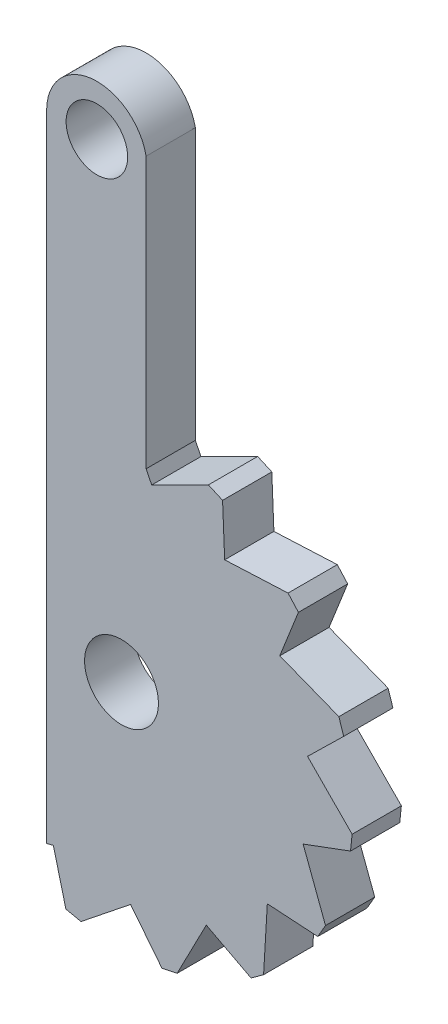
ISO-10303-21;
HEADER;
FILE_DESCRIPTION(('STEP AP214'),'2;1');
FILE_NAME('part.step','',(''),(''),'','','');
FILE_SCHEMA(('AUTOMOTIVE_DESIGN { 1 0 10303 214 1 1 1 1 }'));
ENDSEC;
DATA;
#1=APPLICATION_CONTEXT('core data for automotive mechanical design processes');
#2=APPLICATION_PROTOCOL_DEFINITION('international standard','automotive_design',2000,#1);
#3=PRODUCT_CONTEXT('',#1,'mechanical');
#4=PRODUCT('Part','Part','',(#3));
#5=PRODUCT_RELATED_PRODUCT_CATEGORY('part','',(#4));
#6=PRODUCT_DEFINITION_FORMATION('','',#4);
#7=PRODUCT_DEFINITION_CONTEXT('part definition',#1,'design');
#8=PRODUCT_DEFINITION('design','',#6,#7);
#9=PRODUCT_DEFINITION_SHAPE('','',#8);
#10=(LENGTH_UNIT() NAMED_UNIT(*) SI_UNIT(.MILLI.,.METRE.));
#11=(NAMED_UNIT(*) PLANE_ANGLE_UNIT() SI_UNIT($,.RADIAN.));
#12=(NAMED_UNIT(*) SI_UNIT($,.STERADIAN.) SOLID_ANGLE_UNIT());
#13=UNCERTAINTY_MEASURE_WITH_UNIT(LENGTH_MEASURE(1.E-05),#10,'distance_accuracy_value','');
#14=(GEOMETRIC_REPRESENTATION_CONTEXT(3) GLOBAL_UNCERTAINTY_ASSIGNED_CONTEXT((#13)) GLOBAL_UNIT_ASSIGNED_CONTEXT((#10,
#11,#12)) REPRESENTATION_CONTEXT('',''));
#15=CARTESIAN_POINT('',(0.,0.,0.));
#16=DIRECTION('',(0.,0.,1.));
#17=DIRECTION('',(1.,0.,0.));
#18=AXIS2_PLACEMENT_3D('',#15,#16,#17);
#19=CARTESIAN_POINT('',(-1.00000000000001,18.5923454833598,2.));
#20=DIRECTION('',(0.,0.,-1.));
#21=DIRECTION('',(-1.,0.,0.));
#22=AXIS2_PLACEMENT_3D('',#19,#20,#21);
#23=CYLINDRICAL_SURFACE('',#22,2.04112278046599);
#24=CARTESIAN_POINT('',(-1.00000000000001,18.5923454833598,0.));
#25=DIRECTION('',(0.,0.,1.));
#26=DIRECTION('',(1.,0.,0.));
#27=AXIS2_PLACEMENT_3D('',#24,#25,#26);
#28=CIRCLE('',#27,2.04112278046599);
#29=CARTESIAN_POINT('',(0.999999999999993,19.0000000000001,0.));
#30=VERTEX_POINT('',#29);
#31=CARTESIAN_POINT('',(-3.04095863782557,18.6182306841976,0.));
#32=VERTEX_POINT('',#31);
#33=EDGE_CURVE('E267',#30,#32,#28,.T.);
#34=ORIENTED_EDGE('',*,*,#33,.T.);
#35=DIRECTION('',(0.,0.,-1.));
#36=VECTOR('',#35,1.);
#37=CARTESIAN_POINT('',(-3.04095863782557,18.6182306841976,2.));
#38=LINE('',#37,#36);
#39=CARTESIAN_POINT('',(-3.04095863782557,18.6182306841976,2.));
#40=VERTEX_POINT('',#39);
#41=EDGE_CURVE('E11',#40,#32,#38,.T.);
#42=ORIENTED_EDGE('',*,*,#41,.F.);
#43=CARTESIAN_POINT('',(-1.00000000000001,18.5923454833598,2.));
#44=DIRECTION('',(0.,0.,1.));
#45=DIRECTION('',(1.,0.,0.));
#46=AXIS2_PLACEMENT_3D('',#43,#44,#45);
#47=CIRCLE('',#46,2.04112278046599);
#48=CARTESIAN_POINT('',(0.999999999999993,19.0000000000001,2.));
#49=VERTEX_POINT('',#48);
#50=EDGE_CURVE('E356',#49,#40,#47,.T.);
#51=ORIENTED_EDGE('',*,*,#50,.F.);
#52=DIRECTION('',(0.,0.,-1.));
#53=VECTOR('',#52,1.);
#54=CARTESIAN_POINT('',(0.999999999999993,19.0000000000001,2.));
#55=LINE('',#54,#53);
#56=EDGE_CURVE('E52',#49,#30,#55,.T.);
#57=ORIENTED_EDGE('',*,*,#56,.T.);
#58=EDGE_LOOP('',(#34,#42,#51,#57));
#59=FACE_BOUND('',#58,.T.);
#60=ADVANCED_FACE('F36',(#59),#23,.T.);
#61=CARTESIAN_POINT('',(-3.04095863782854,4.85407544590212E-13,2.));
#62=DIRECTION('',(1.,-1.59623198603196E-13,0.));
#63=DIRECTION('',(1.59623198603196E-13,1.,0.));
#64=AXIS2_PLACEMENT_3D('',#61,#62,#63);
#65=PLANE('',#64);
#66=DIRECTION('',(-1.59623198603196E-13,-1.,0.));
#67=VECTOR('',#66,1.);
#68=CARTESIAN_POINT('',(-3.04095863782854,4.85407544590212E-13,0.));
#69=LINE('',#68,#67);
#70=CARTESIAN_POINT('',(-3.04095863782969,-7.19778887463136,0.));
#71=VERTEX_POINT('',#70);
#72=EDGE_CURVE('E269',#32,#71,#69,.T.);
#73=ORIENTED_EDGE('',*,*,#72,.T.);
#74=DIRECTION('',(0.,0.,-1.));
#75=VECTOR('',#74,1.);
#76=CARTESIAN_POINT('',(-3.04095863782969,-7.19778887463136,2.));
#77=LINE('',#76,#75);
#78=CARTESIAN_POINT('',(-3.04095863782969,-7.19778887463136,2.));
#79=VERTEX_POINT('',#78);
#80=EDGE_CURVE('E44',#79,#71,#77,.T.);
#81=ORIENTED_EDGE('',*,*,#80,.F.);
#82=DIRECTION('',(-1.59623198603196E-13,-1.,0.));
#83=VECTOR('',#82,1.);
#84=CARTESIAN_POINT('',(-3.04095863782854,4.85407544590212E-13,2.));
#85=LINE('',#84,#83);
#86=EDGE_CURVE('E154',#40,#79,#85,.T.);
#87=ORIENTED_EDGE('',*,*,#86,.F.);
#88=ORIENTED_EDGE('',*,*,#41,.T.);
#89=EDGE_LOOP('',(#73,#81,#87,#88));
#90=FACE_BOUND('',#89,.T.);
#91=ADVANCED_FACE('F411',(#90),#65,.F.);
#92=CARTESIAN_POINT('',(1.56534970078855,-5.99504923017567,2.));
#93=DIRECTION('',(0.25263704337826,-0.967561121745335,0.));
#94=DIRECTION('',(0.967561121745335,0.25263704337826,0.));
#95=AXIS2_PLACEMENT_3D('',#92,#93,#94);
#96=PLANE('',#95);
#97=DIRECTION('',(-0.967561121745335,-0.25263704337826,0.));
#98=VECTOR('',#97,1.);
#99=CARTESIAN_POINT('',(1.56534970078855,-5.99504923017567,0.));
#100=LINE('',#99,#98);
#101=CARTESIAN_POINT('',(-2.76871844959144,-7.12670503847929,0.));
#102=VERTEX_POINT('',#101);
#103=EDGE_CURVE('E272',#102,#71,#100,.T.);
#104=ORIENTED_EDGE('',*,*,#103,.F.);
#105=DIRECTION('',(0.,0.,-1.));
#106=VECTOR('',#105,1.);
#107=CARTESIAN_POINT('',(-2.76871844959144,-7.12670503847929,2.));
#108=LINE('',#107,#106);
#109=CARTESIAN_POINT('',(-2.76871844959144,-7.12670503847929,2.));
#110=VERTEX_POINT('',#109);
#111=EDGE_CURVE('E404',#110,#102,#108,.T.);
#112=ORIENTED_EDGE('',*,*,#111,.F.);
#113=DIRECTION('',(-0.967561121745335,-0.25263704337826,0.));
#114=VECTOR('',#113,1.);
#115=CARTESIAN_POINT('',(1.56534970078855,-5.99504923017567,2.));
#116=LINE('',#115,#114);
#117=EDGE_CURVE('E410',#110,#79,#116,.T.);
#118=ORIENTED_EDGE('',*,*,#117,.T.);
#119=ORIENTED_EDGE('',*,*,#80,.T.);
#120=EDGE_LOOP('',(#104,#112,#118,#119));
#121=FACE_BOUND('',#120,.T.);
#122=ADVANCED_FACE('F408',(#121),#96,.T.);
#123=CARTESIAN_POINT('',(-4.31252105353549,-1.10575207483053,2.));
#124=DIRECTION('',(0.968665084890065,0.248370596719746,0.));
#125=DIRECTION('',(-0.248370596719746,0.968665084890065,0.));
#126=AXIS2_PLACEMENT_3D('',#123,#124,#125);
#127=PLANE('',#126);
#128=DIRECTION('',(0.248370596719746,-0.968665084890065,0.));
#129=VECTOR('',#128,1.);
#130=CARTESIAN_POINT('',(-4.31252105353549,-1.10575207483053,0.));
#131=LINE('',#130,#129);
#132=CARTESIAN_POINT('',(-2.25894839994869,-9.11484878388727,0.));
#133=VERTEX_POINT('',#132);
#134=EDGE_CURVE('E275',#102,#133,#131,.T.);
#135=ORIENTED_EDGE('',*,*,#134,.T.);
#136=DIRECTION('',(0.,0.,-1.));
#137=VECTOR('',#136,1.);
#138=CARTESIAN_POINT('',(-2.25894839994869,-9.11484878388727,2.));
#139=LINE('',#138,#137);
#140=CARTESIAN_POINT('',(-2.25894839994869,-9.11484878388727,2.));
#141=VERTEX_POINT('',#140);
#142=EDGE_CURVE('E402',#141,#133,#139,.T.);
#143=ORIENTED_EDGE('',*,*,#142,.F.);
#144=DIRECTION('',(0.248370596719746,-0.968665084890065,0.));
#145=VECTOR('',#144,1.);
#146=CARTESIAN_POINT('',(-4.31252105353549,-1.10575207483053,2.));
#147=LINE('',#146,#145);
#148=EDGE_CURVE('E423',#110,#141,#147,.T.);
#149=ORIENTED_EDGE('',*,*,#148,.F.);
#150=ORIENTED_EDGE('',*,*,#111,.T.);
#151=EDGE_LOOP('',(#135,#143,#149,#150));
#152=FACE_BOUND('',#151,.T.);
#153=ADVANCED_FACE('F420',(#152),#127,.F.);
#154=CARTESIAN_POINT('',(-1.95131967331422,-9.18023728829162,2.));
#155=DIRECTION('',(-0.207911690817762,-0.978147600733805,0.));
#156=DIRECTION('',(0.978147600733805,-0.207911690817762,0.));
#157=AXIS2_PLACEMENT_3D('',#154,#155,#156);
#158=PLANE('',#157);
#159=DIRECTION('',(-0.978147600733805,0.207911690817762,0.));
#160=VECTOR('',#159,1.);
#161=CARTESIAN_POINT('',(-1.95131967331422,-9.18023728829162,0.));
#162=LINE('',#161,#160);
#163=CARTESIAN_POINT('',(-1.64369094667786,-9.24562579269637,0.));
#164=VERTEX_POINT('',#163);
#165=EDGE_CURVE('E278',#164,#133,#162,.T.);
#166=ORIENTED_EDGE('',*,*,#165,.F.);
#167=DIRECTION('',(0.,0.,-1.));
#168=VECTOR('',#167,1.);
#169=CARTESIAN_POINT('',(-1.64369094667786,-9.24562579269637,2.));
#170=LINE('',#169,#168);
#171=CARTESIAN_POINT('',(-1.64369094667786,-9.24562579269637,2.));
#172=VERTEX_POINT('',#171);
#173=EDGE_CURVE('E400',#172,#164,#170,.T.);
#174=ORIENTED_EDGE('',*,*,#173,.F.);
#175=DIRECTION('',(-0.978147600733805,0.207911690817762,0.));
#176=VECTOR('',#175,1.);
#177=CARTESIAN_POINT('',(-1.95131967331422,-9.18023728829162,2.));
#178=LINE('',#177,#176);
#179=EDGE_CURVE('E425',#172,#141,#178,.T.);
#180=ORIENTED_EDGE('',*,*,#179,.T.);
#181=ORIENTED_EDGE('',*,*,#142,.T.);
#182=EDGE_LOOP('',(#166,#174,#180,#181));
#183=FACE_BOUND('',#182,.T.);
#184=ADVANCED_FACE('F517',(#183),#158,.T.);
#185=CARTESIAN_POINT('',(3.86842430773349,-4.840064910032,2.));
#186=DIRECTION('',(0.624337986039853,-0.781154324821735,0.));
#187=DIRECTION('',(0.781154324821735,0.624337986039853,0.));
#188=AXIS2_PLACEMENT_3D('',#185,#186,#187);
#189=PLANE('',#188);
#190=DIRECTION('',(-0.781154324821735,-0.624337986039853,0.));
#191=VECTOR('',#190,1.);
#192=CARTESIAN_POINT('',(3.86842430773349,-4.840064910032,0.));
#193=LINE('',#192,#191);
#194=CARTESIAN_POINT('',(0.369341920426934,-7.63670826367027,0.));
#195=VERTEX_POINT('',#194);
#196=EDGE_CURVE('E281',#195,#164,#193,.T.);
#197=ORIENTED_EDGE('',*,*,#196,.F.);
#198=DIRECTION('',(0.,0.,-1.));
#199=VECTOR('',#198,1.);
#200=CARTESIAN_POINT('',(0.369341920426934,-7.63670826367027,2.));
#201=LINE('',#200,#199);
#202=CARTESIAN_POINT('',(0.369341920426934,-7.63670826367027,2.));
#203=VERTEX_POINT('',#202);
#204=EDGE_CURVE('E398',#203,#195,#201,.T.);
#205=ORIENTED_EDGE('',*,*,#204,.F.);
#206=DIRECTION('',(-0.781154324821735,-0.624337986039853,0.));
#207=VECTOR('',#206,1.);
#208=CARTESIAN_POINT('',(3.86842430773349,-4.840064910032,2.));
#209=LINE('',#208,#207);
#210=EDGE_CURVE('E432',#203,#172,#209,.T.);
#211=ORIENTED_EDGE('',*,*,#210,.T.);
#212=ORIENTED_EDGE('',*,*,#173,.T.);
#213=EDGE_LOOP('',(#197,#205,#211,#212));
#214=FACE_BOUND('',#213,.T.);
#215=ADVANCED_FACE('F520',(#214),#189,.T.);
#216=CARTESIAN_POINT('',(-3.4899341324546,-2.76421512174847,2.));
#217=DIRECTION('',(0.78389816552983,0.620889415338164,0.));
#218=DIRECTION('',(-0.620889415338164,0.78389816552983,0.));
#219=AXIS2_PLACEMENT_3D('',#216,#217,#218);
#220=PLANE('',#219);
#221=DIRECTION('',(0.620889415338164,-0.78389816552983,0.));
#222=VECTOR('',#221,1.);
#223=CARTESIAN_POINT('',(-3.4899341324546,-2.76421512174847,0.));
#224=LINE('',#223,#222);
#225=CARTESIAN_POINT('',(1.64369094667964,-9.24562579269618,0.));
#226=VERTEX_POINT('',#225);
#227=EDGE_CURVE('E284',#195,#226,#224,.T.);
#228=ORIENTED_EDGE('',*,*,#227,.T.);
#229=DIRECTION('',(0.,0.,-1.));
#230=VECTOR('',#229,1.);
#231=CARTESIAN_POINT('',(1.64369094667964,-9.24562579269618,2.));
#232=LINE('',#231,#230);
#233=CARTESIAN_POINT('',(1.64369094667964,-9.24562579269618,2.));
#234=VERTEX_POINT('',#233);
#235=EDGE_CURVE('E396',#234,#226,#232,.T.);
#236=ORIENTED_EDGE('',*,*,#235,.F.);
#237=DIRECTION('',(0.620889415338164,-0.78389816552983,0.));
#238=VECTOR('',#237,1.);
#239=CARTESIAN_POINT('',(-3.4899341324546,-2.76421512174847,2.));
#240=LINE('',#239,#238);
#241=EDGE_CURVE('E435',#203,#234,#240,.T.);
#242=ORIENTED_EDGE('',*,*,#241,.F.);
#243=ORIENTED_EDGE('',*,*,#204,.T.);
#244=EDGE_LOOP('',(#228,#236,#242,#243));
#245=FACE_BOUND('',#244,.T.);
#246=ADVANCED_FACE('F524',(#245),#220,.F.);
#247=CARTESIAN_POINT('',(1.95131967331423,-9.18023728829181,2.));
#248=DIRECTION('',(0.207911690817759,-0.978147600733806,0.));
#249=DIRECTION('',(0.978147600733806,0.207911690817759,0.));
#250=AXIS2_PLACEMENT_3D('',#247,#248,#249);
#251=PLANE('',#250);
#252=DIRECTION('',(-0.978147600733806,-0.207911690817759,0.));
#253=VECTOR('',#252,1.);
#254=CARTESIAN_POINT('',(1.95131967331423,-9.18023728829181,0.));
#255=LINE('',#254,#253);
#256=CARTESIAN_POINT('',(2.25894839995047,-9.11484878388708,0.));
#257=VERTEX_POINT('',#256);
#258=EDGE_CURVE('E287',#257,#226,#255,.T.);
#259=ORIENTED_EDGE('',*,*,#258,.F.);
#260=DIRECTION('',(0.,0.,-1.));
#261=VECTOR('',#260,1.);
#262=CARTESIAN_POINT('',(2.25894839995047,-9.11484878388708,2.));
#263=LINE('',#262,#261);
#264=CARTESIAN_POINT('',(2.25894839995047,-9.11484878388708,2.));
#265=VERTEX_POINT('',#264);
#266=EDGE_CURVE('E394',#265,#257,#263,.T.);
#267=ORIENTED_EDGE('',*,*,#266,.F.);
#268=DIRECTION('',(-0.978147600733806,-0.207911690817759,0.));
#269=VECTOR('',#268,1.);
#270=CARTESIAN_POINT('',(1.95131967331423,-9.18023728829181,2.));
#271=LINE('',#270,#269);
#272=EDGE_CURVE('E437',#265,#234,#271,.T.);
#273=ORIENTED_EDGE('',*,*,#272,.T.);
#274=ORIENTED_EDGE('',*,*,#235,.T.);
#275=EDGE_LOOP('',(#259,#267,#273,#274));
#276=FACE_BOUND('',#275,.T.);
#277=ADVANCED_FACE('F528',(#276),#251,.T.);
#278=CARTESIAN_POINT('',(5.50261320833953,-2.84818939633463,2.));
#279=DIRECTION('',(0.888085218982579,-0.459678848572201,0.));
#280=DIRECTION('',(0.459678848572201,0.888085218982579,0.));
#281=AXIS2_PLACEMENT_3D('',#278,#279,#280);
#282=PLANE('',#281);
#283=DIRECTION('',(-0.459678848572201,-0.888085218982579,0.));
#284=VECTOR('',#283,1.);
#285=CARTESIAN_POINT('',(5.50261320833953,-2.84818939633463,0.));
#286=LINE('',#285,#284);
#287=CARTESIAN_POINT('',(3.44353971703748,-6.82625525275609,0.));
#288=VERTEX_POINT('',#287);
#289=EDGE_CURVE('E290',#288,#257,#286,.T.);
#290=ORIENTED_EDGE('',*,*,#289,.F.);
#291=DIRECTION('',(0.,0.,-1.));
#292=VECTOR('',#291,1.);
#293=CARTESIAN_POINT('',(3.44353971703748,-6.82625525275609,2.));
#294=LINE('',#293,#292);
#295=CARTESIAN_POINT('',(3.44353971703748,-6.82625525275609,2.));
#296=VERTEX_POINT('',#295);
#297=EDGE_CURVE('E392',#296,#288,#294,.T.);
#298=ORIENTED_EDGE('',*,*,#297,.F.);
#299=DIRECTION('',(-0.459678848572201,-0.888085218982579,0.));
#300=VECTOR('',#299,1.);
#301=CARTESIAN_POINT('',(5.50261320833953,-2.84818939633463,2.));
#302=LINE('',#301,#300);
#303=EDGE_CURVE('E440',#296,#265,#302,.T.);
#304=ORIENTED_EDGE('',*,*,#303,.T.);
#305=ORIENTED_EDGE('',*,*,#266,.T.);
#306=EDGE_LOOP('',(#290,#298,#304,#305));
#307=FACE_BOUND('',#306,.T.);
#308=ADVANCED_FACE('F532',(#307),#282,.T.);
#309=CARTESIAN_POINT('',(-2.06390589481655,-3.94472026200985,2.));
#310=DIRECTION('',(0.463588131858286,0.886050813441387,0.));
#311=DIRECTION('',(-0.886050813441387,0.463588131858286,0.));
#312=AXIS2_PLACEMENT_3D('',#309,#310,#311);
#313=PLANE('',#312);
#314=DIRECTION('',(0.886050813441387,-0.463588131858286,0.));
#315=VECTOR('',#314,1.);
#316=CARTESIAN_POINT('',(-2.06390589481655,-3.94472026200985,0.));
#317=LINE('',#316,#315);
#318=CARTESIAN_POINT('',(5.26212119616367,-7.77775010807451,0.));
#319=VERTEX_POINT('',#318);
#320=EDGE_CURVE('E293',#288,#319,#317,.T.);
#321=ORIENTED_EDGE('',*,*,#320,.T.);
#322=DIRECTION('',(0.,0.,-1.));
#323=VECTOR('',#322,1.);
#324=CARTESIAN_POINT('',(5.26212119616367,-7.77775010807451,2.));
#325=LINE('',#324,#323);
#326=CARTESIAN_POINT('',(5.26212119616367,-7.77775010807451,2.));
#327=VERTEX_POINT('',#326);
#328=EDGE_CURVE('E390',#327,#319,#325,.T.);
#329=ORIENTED_EDGE('',*,*,#328,.F.);
#330=DIRECTION('',(0.886050813441387,-0.463588131858286,0.));
#331=VECTOR('',#330,1.);
#332=CARTESIAN_POINT('',(-2.06390589481655,-3.94472026200985,2.));
#333=LINE('',#332,#331);
#334=EDGE_CURVE('E443',#296,#327,#333,.T.);
#335=ORIENTED_EDGE('',*,*,#334,.F.);
#336=ORIENTED_EDGE('',*,*,#297,.T.);
#337=EDGE_LOOP('',(#321,#329,#335,#336));
#338=FACE_BOUND('',#337,.T.);
#339=ADVANCED_FACE('F536',(#338),#313,.F.);
#340=CARTESIAN_POINT('',(5.51655812124403,-7.59289086130872,2.));
#341=DIRECTION('',(0.587785252292472,-0.809016994374948,0.));
#342=DIRECTION('',(0.809016994374948,0.587785252292472,0.));
#343=AXIS2_PLACEMENT_3D('',#340,#341,#342);
#344=PLANE('',#343);
#345=DIRECTION('',(-0.809016994374948,-0.587785252292472,0.));
#346=VECTOR('',#345,1.);
#347=CARTESIAN_POINT('',(5.51655812124403,-7.59289086130872,0.));
#348=LINE('',#347,#346);
#349=CARTESIAN_POINT('',(5.77099504632548,-7.40803161454213,0.));
#350=VERTEX_POINT('',#349);
#351=EDGE_CURVE('E296',#350,#319,#348,.T.);
#352=ORIENTED_EDGE('',*,*,#351,.F.);
#353=DIRECTION('',(0.,0.,-1.));
#354=VECTOR('',#353,1.);
#355=CARTESIAN_POINT('',(5.77099504632548,-7.40803161454213,2.));
#356=LINE('',#355,#354);
#357=CARTESIAN_POINT('',(5.77099504632548,-7.40803161454213,2.));
#358=VERTEX_POINT('',#357);
#359=EDGE_CURVE('E388',#358,#350,#356,.T.);
#360=ORIENTED_EDGE('',*,*,#359,.F.);
#361=DIRECTION('',(-0.809016994374948,-0.587785252292472,0.));
#362=VECTOR('',#361,1.);
#363=CARTESIAN_POINT('',(5.51655812124403,-7.59289086130872,2.));
#364=LINE('',#363,#362);
#365=EDGE_CURVE('E445',#358,#327,#364,.T.);
#366=ORIENTED_EDGE('',*,*,#365,.T.);
#367=ORIENTED_EDGE('',*,*,#328,.T.);
#368=EDGE_LOOP('',(#352,#360,#366,#367));
#369=FACE_BOUND('',#368,.T.);
#370=ADVANCED_FACE('F540',(#369),#344,.T.);
#371=CARTESIAN_POINT('',(6.18535029555207,-0.363836061022866,2.));
#372=DIRECTION('',(0.998274449562275,-0.058720723353323,0.));
#373=DIRECTION('',(0.058720723353323,0.998274449562275,0.));
#374=AXIS2_PLACEMENT_3D('',#371,#372,#373);
#375=PLANE('',#374);
#376=DIRECTION('',(-0.0587207233533231,-0.998274449562275,0.));
#377=VECTOR('',#376,1.);
#378=CARTESIAN_POINT('',(6.18535029555207,-0.363836061022866,0.));
#379=LINE('',#378,#377);
#380=CARTESIAN_POINT('',(5.92231821299603,-4.83548069405827,0.));
#381=VERTEX_POINT('',#380);
#382=EDGE_CURVE('E299',#381,#350,#379,.T.);
#383=ORIENTED_EDGE('',*,*,#382,.F.);
#384=DIRECTION('',(0.,0.,-1.));
#385=VECTOR('',#384,1.);
#386=CARTESIAN_POINT('',(5.92231821299603,-4.83548069405827,2.));
#387=LINE('',#386,#385);
#388=CARTESIAN_POINT('',(5.92231821299603,-4.83548069405827,2.));
#389=VERTEX_POINT('',#388);
#390=EDGE_CURVE('E386',#389,#381,#387,.T.);
#391=ORIENTED_EDGE('',*,*,#390,.F.);
#392=DIRECTION('',(-0.0587207233533231,-0.998274449562275,0.));
#393=VECTOR('',#392,1.);
#394=CARTESIAN_POINT('',(6.18535029555207,-0.363836061022866,2.));
#395=LINE('',#394,#393);
#396=EDGE_CURVE('E448',#389,#358,#395,.T.);
#397=ORIENTED_EDGE('',*,*,#396,.T.);
#398=ORIENTED_EDGE('',*,*,#359,.T.);
#399=EDGE_LOOP('',(#383,#391,#397,#398));
#400=FACE_BOUND('',#399,.T.);
#401=ADVANCED_FACE('F544',(#400),#375,.T.);
#402=CARTESIAN_POINT('',(-0.281009577968845,-4.44314743231128,2.));
#403=DIRECTION('',(0.0631194986225176,0.998005976381726,0.));
#404=DIRECTION('',(-0.998005976381726,0.0631194986225176,0.));
#405=AXIS2_PLACEMENT_3D('',#402,#403,#404);
#406=PLANE('',#405);
#407=DIRECTION('',(0.998005976381726,-0.0631194986225176,0.));
#408=VECTOR('',#407,1.);
#409=CARTESIAN_POINT('',(-0.281009577968845,-4.44314743231128,0.));
#410=LINE('',#409,#408);
#411=CARTESIAN_POINT('',(7.97068288596077,-4.9650307711253,0.));
#412=VERTEX_POINT('',#411);
#413=EDGE_CURVE('E302',#381,#412,#410,.T.);
#414=ORIENTED_EDGE('',*,*,#413,.T.);
#415=DIRECTION('',(0.,0.,-1.));
#416=VECTOR('',#415,1.);
#417=CARTESIAN_POINT('',(7.97068288596077,-4.9650307711253,2.));
#418=LINE('',#417,#416);
#419=CARTESIAN_POINT('',(7.97068288596077,-4.9650307711253,2.));
#420=VERTEX_POINT('',#419);
#421=EDGE_CURVE('E384',#420,#412,#418,.T.);
#422=ORIENTED_EDGE('',*,*,#421,.F.);
#423=DIRECTION('',(0.998005976381726,-0.0631194986225176,0.));
#424=VECTOR('',#423,1.);
#425=CARTESIAN_POINT('',(-0.281009577968845,-4.44314743231128,2.));
#426=LINE('',#425,#424);
#427=EDGE_CURVE('E451',#389,#420,#426,.T.);
#428=ORIENTED_EDGE('',*,*,#427,.F.);
#429=ORIENTED_EDGE('',*,*,#390,.T.);
#430=EDGE_LOOP('',(#414,#422,#428,#429));
#431=FACE_BOUND('',#430,.T.);
#432=ADVANCED_FACE('F548',(#431),#406,.F.);
#433=CARTESIAN_POINT('',(8.12793355365355,-4.69266462515728,2.));
#434=DIRECTION('',(0.866025403784438,-0.500000000000001,0.));
#435=DIRECTION('',(0.500000000000001,0.866025403784438,0.));
#436=AXIS2_PLACEMENT_3D('',#433,#434,#435);
#437=PLANE('',#436);
#438=DIRECTION('',(-0.500000000000001,-0.866025403784438,0.));
#439=VECTOR('',#438,1.);
#440=CARTESIAN_POINT('',(8.12793355365355,-4.69266462515728,0.));
#441=LINE('',#440,#439);
#442=CARTESIAN_POINT('',(8.28518422134679,-4.42029847918845,0.));
#443=VERTEX_POINT('',#442);
#444=EDGE_CURVE('E305',#443,#412,#441,.T.);
#445=ORIENTED_EDGE('',*,*,#444,.F.);
#446=DIRECTION('',(0.,0.,-1.));
#447=VECTOR('',#446,1.);
#448=CARTESIAN_POINT('',(8.28518422134679,-4.42029847918845,2.));
#449=LINE('',#448,#447);
#450=CARTESIAN_POINT('',(8.28518422134679,-4.42029847918845,2.));
#451=VERTEX_POINT('',#450);
#452=EDGE_CURVE('E382',#451,#443,#449,.T.);
#453=ORIENTED_EDGE('',*,*,#452,.F.);
#454=DIRECTION('',(-0.500000000000001,-0.866025403784438,0.));
#455=VECTOR('',#454,1.);
#456=CARTESIAN_POINT('',(8.12793355365355,-4.69266462515728,2.));
#457=LINE('',#456,#455);
#458=EDGE_CURVE('E453',#451,#420,#457,.T.);
#459=ORIENTED_EDGE('',*,*,#458,.T.);
#460=ORIENTED_EDGE('',*,*,#421,.T.);
#461=EDGE_LOOP('',(#445,#453,#459,#460));
#462=FACE_BOUND('',#461,.T.);
#463=ADVANCED_FACE('F552',(#462),#437,.T.);
#464=CARTESIAN_POINT('',(5.79858412452056,2.18342783458654,2.));
#465=DIRECTION('',(0.935852958774013,0.352390748394342,0.));
#466=DIRECTION('',(-0.352390748394342,0.935852958774014,0.));
#467=AXIS2_PLACEMENT_3D('',#464,#465,#466);
#468=PLANE('',#467);
#469=DIRECTION('',(0.352390748394342,-0.935852958774014,0.));
#470=VECTOR('',#469,1.);
#471=CARTESIAN_POINT('',(5.79858412452056,2.18342783458654,0.));
#472=LINE('',#471,#470);
#473=CARTESIAN_POINT('',(7.37707408735567,-2.00860759439476,0.));
#474=VERTEX_POINT('',#473);
#475=EDGE_CURVE('E308',#474,#443,#472,.T.);
#476=ORIENTED_EDGE('',*,*,#475,.F.);
#477=DIRECTION('',(0.,0.,-1.));
#478=VECTOR('',#477,1.);
#479=CARTESIAN_POINT('',(7.37707408735567,-2.00860759439476,2.));
#480=LINE('',#479,#478);
#481=CARTESIAN_POINT('',(7.37707408735567,-2.00860759439476,2.));
#482=VERTEX_POINT('',#481);
#483=EDGE_CURVE('E380',#482,#474,#480,.T.);
#484=ORIENTED_EDGE('',*,*,#483,.F.);
#485=DIRECTION('',(0.352390748394342,-0.935852958774014,0.));
#486=VECTOR('',#485,1.);
#487=CARTESIAN_POINT('',(5.79858412452056,2.18342783458654,2.));
#488=LINE('',#487,#486);
#489=EDGE_CURVE('E456',#482,#451,#488,.T.);
#490=ORIENTED_EDGE('',*,*,#489,.T.);
#491=ORIENTED_EDGE('',*,*,#452,.T.);
#492=EDGE_LOOP('',(#476,#484,#490,#491));
#493=FACE_BOUND('',#492,.T.);
#494=ADVANCED_FACE('F556',(#493),#468,.T.);
#495=CARTESIAN_POINT('',(1.55047584780117,-4.17331404683924,2.));
#496=DIRECTION('',(-0.348263069347739,0.937396839406071,0.));
#497=DIRECTION('',(-0.937396839406071,-0.348263069347739,0.));
#498=AXIS2_PLACEMENT_3D('',#495,#496,#497);
#499=PLANE('',#498);
#500=DIRECTION('',(0.937396839406071,0.348263069347739,0.));
#501=VECTOR('',#500,1.);
#502=CARTESIAN_POINT('',(1.55047584780117,-4.17331404683924,0.));
#503=LINE('',#502,#501);
#504=CARTESIAN_POINT('',(9.30104109339458,-1.29381250796005,0.));
#505=VERTEX_POINT('',#504);
#506=EDGE_CURVE('E311',#474,#505,#503,.T.);
#507=ORIENTED_EDGE('',*,*,#506,.T.);
#508=DIRECTION('',(0.,0.,-1.));
#509=VECTOR('',#508,1.);
#510=CARTESIAN_POINT('',(9.30104109339458,-1.29381250796005,2.));
#511=LINE('',#510,#509);
#512=CARTESIAN_POINT('',(9.30104109339458,-1.29381250796005,2.));
#513=VERTEX_POINT('',#512);
#514=EDGE_CURVE('E378',#513,#505,#511,.T.);
#515=ORIENTED_EDGE('',*,*,#514,.F.);
#516=DIRECTION('',(0.937396839406071,0.348263069347739,0.));
#517=VECTOR('',#516,1.);
#518=CARTESIAN_POINT('',(1.55047584780117,-4.17331404683924,2.));
#519=LINE('',#518,#517);
#520=EDGE_CURVE('E459',#482,#513,#519,.T.);
#521=ORIENTED_EDGE('',*,*,#520,.F.);
#522=ORIENTED_EDGE('',*,*,#483,.T.);
#523=EDGE_LOOP('',(#507,#515,#521,#522));
#524=FACE_BOUND('',#523,.T.);
#525=ADVANCED_FACE('F560',(#524),#499,.F.);
#526=CARTESIAN_POINT('',(9.33391543467808,-0.9810340437963,2.));
#527=DIRECTION('',(0.994521895368274,-0.10452846326765,0.));
#528=DIRECTION('',(0.10452846326765,0.994521895368274,0.));
#529=AXIS2_PLACEMENT_3D('',#526,#527,#528);
#530=PLANE('',#529);
#531=DIRECTION('',(-0.10452846326765,-0.994521895368274,0.));
#532=VECTOR('',#531,1.);
#533=CARTESIAN_POINT('',(9.33391543467808,-0.9810340437963,0.));
#534=LINE('',#533,#532);
#535=CARTESIAN_POINT('',(9.36678977596162,-0.668255579632131,0.));
#536=VERTEX_POINT('',#535);
#537=EDGE_CURVE('E314',#536,#505,#534,.T.);
#538=ORIENTED_EDGE('',*,*,#537,.F.);
#539=DIRECTION('',(0.,0.,-1.));
#540=VECTOR('',#539,1.);
#541=CARTESIAN_POINT('',(9.36678977596162,-0.668255579632131,2.));
#542=LINE('',#541,#540);
#543=CARTESIAN_POINT('',(9.36678977596162,-0.668255579632131,2.));
#544=VERTEX_POINT('',#543);
#545=EDGE_CURVE('E376',#544,#536,#542,.T.);
#546=ORIENTED_EDGE('',*,*,#545,.F.);
#547=DIRECTION('',(-0.10452846326765,-0.994521895368274,0.));
#548=VECTOR('',#547,1.);
#549=CARTESIAN_POINT('',(9.33391543467808,-0.9810340437963,2.));
#550=LINE('',#549,#548);
#551=EDGE_CURVE('E461',#544,#513,#550,.T.);
#552=ORIENTED_EDGE('',*,*,#551,.T.);
#553=ORIENTED_EDGE('',*,*,#514,.T.);
#554=EDGE_LOOP('',(#538,#546,#552,#553));
#555=FACE_BOUND('',#554,.T.);
#556=ADVANCED_FACE('F564',(#555),#530,.T.);
#557=CARTESIAN_POINT('',(4.40919007987675,4.35315722177698,2.));
#558=DIRECTION('',(0.711613989456552,0.702570658375178,0.));
#559=DIRECTION('',(-0.702570658375178,0.711613989456552,0.));
#560=AXIS2_PLACEMENT_3D('',#557,#558,#559);
#561=PLANE('',#560);
#562=DIRECTION('',(0.702570658375178,-0.711613989456552,0.));
#563=VECTOR('',#562,1.);
#564=CARTESIAN_POINT('',(4.40919007987675,4.35315722177698,0.));
#565=LINE('',#564,#563);
#566=CARTESIAN_POINT('',(7.55626683339738,1.16557200596673,0.));
#567=VERTEX_POINT('',#566);
#568=EDGE_CURVE('E317',#567,#536,#565,.T.);
#569=ORIENTED_EDGE('',*,*,#568,.F.);
#570=DIRECTION('',(0.,0.,-1.));
#571=VECTOR('',#570,1.);
#572=CARTESIAN_POINT('',(7.55626683339738,1.16557200596673,2.));
#573=LINE('',#572,#571);
#574=CARTESIAN_POINT('',(7.55626683339738,1.16557200596673,2.));
#575=VERTEX_POINT('',#574);
#576=EDGE_CURVE('E374',#575,#567,#573,.T.);
#577=ORIENTED_EDGE('',*,*,#576,.F.);
#578=DIRECTION('',(0.702570658375178,-0.711613989456552,0.));
#579=VECTOR('',#578,1.);
#580=CARTESIAN_POINT('',(4.40919007987675,4.35315722177698,2.));
#581=LINE('',#580,#579);
#582=EDGE_CURVE('E464',#575,#544,#581,.T.);
#583=ORIENTED_EDGE('',*,*,#582,.T.);
#584=ORIENTED_EDGE('',*,*,#545,.T.);
#585=EDGE_LOOP('',(#569,#577,#583,#584));
#586=FACE_BOUND('',#585,.T.);
#587=ADVANCED_FACE('F568',(#586),#561,.T.);
#588=CARTESIAN_POINT('',(3.11386991385545,-3.18187674930124,2.));
#589=DIRECTION('',(-0.699427788757155,0.714703272914205,0.));
#590=DIRECTION('',(-0.714703272914205,-0.699427788757155,0.));
#591=AXIS2_PLACEMENT_3D('',#588,#589,#590);
#592=PLANE('',#591);
#593=DIRECTION('',(0.714703272914205,0.699427788757155,0.));
#594=VECTOR('',#593,1.);
#595=CARTESIAN_POINT('',(3.11386991385545,-3.18187674930124,0.));
#596=LINE('',#595,#594);
#597=CARTESIAN_POINT('',(9.02316479847487,2.60111769174909,0.));
#598=VERTEX_POINT('',#597);
#599=EDGE_CURVE('E320',#567,#598,#596,.T.);
#600=ORIENTED_EDGE('',*,*,#599,.T.);
#601=DIRECTION('',(0.,0.,-1.));
#602=VECTOR('',#601,1.);
#603=CARTESIAN_POINT('',(9.02316479847487,2.60111769174909,2.));
#604=LINE('',#603,#602);
#605=CARTESIAN_POINT('',(9.02316479847487,2.60111769174909,2.));
#606=VERTEX_POINT('',#605);
#607=EDGE_CURVE('E372',#606,#598,#604,.T.);
#608=ORIENTED_EDGE('',*,*,#607,.F.);
#609=DIRECTION('',(0.714703272914205,0.699427788757155,0.));
#610=VECTOR('',#609,1.);
#611=CARTESIAN_POINT('',(3.11386991385545,-3.18187674930124,2.));
#612=LINE('',#611,#610);
#613=EDGE_CURVE('E467',#575,#606,#612,.T.);
#614=ORIENTED_EDGE('',*,*,#613,.F.);
#615=ORIENTED_EDGE('',*,*,#576,.T.);
#616=EDGE_LOOP('',(#600,#608,#614,#615));
#617=FACE_BOUND('',#616,.T.);
#618=ADVANCED_FACE('F572',(#617),#592,.F.);
#619=CARTESIAN_POINT('',(8.92597854108699,2.90022623615144,2.));
#620=DIRECTION('',(0.951056516295153,0.309016994374949,0.));
#621=DIRECTION('',(-0.309016994374949,0.951056516295153,0.));
#622=AXIS2_PLACEMENT_3D('',#619,#620,#621);
#623=PLANE('',#622);
#624=DIRECTION('',(0.309016994374949,-0.951056516295153,0.));
#625=VECTOR('',#624,1.);
#626=CARTESIAN_POINT('',(8.92597854108699,2.90022623615144,0.));
#627=LINE('',#626,#625);
#628=CARTESIAN_POINT('',(8.82879228369908,3.1993347805539,0.));
#629=VERTEX_POINT('',#628);
#630=EDGE_CURVE('E323',#629,#598,#627,.T.);
#631=ORIENTED_EDGE('',*,*,#630,.F.);
#632=DIRECTION('',(0.,0.,-1.));
#633=VECTOR('',#632,1.);
#634=CARTESIAN_POINT('',(8.82879228369908,3.1993347805539,2.));
#635=LINE('',#634,#633);
#636=CARTESIAN_POINT('',(8.82879228369908,3.1993347805539,2.));
#637=VERTEX_POINT('',#636);
#638=EDGE_CURVE('E370',#637,#629,#635,.T.);
#639=ORIENTED_EDGE('',*,*,#638,.F.);
#640=DIRECTION('',(0.309016994374949,-0.951056516295153,0.));
#641=VECTOR('',#640,1.);
#642=CARTESIAN_POINT('',(8.92597854108699,2.90022623615144,2.));
#643=LINE('',#642,#641);
#644=EDGE_CURVE('E469',#637,#606,#643,.T.);
#645=ORIENTED_EDGE('',*,*,#644,.T.);
#646=ORIENTED_EDGE('',*,*,#607,.T.);
#647=EDGE_LOOP('',(#631,#639,#645,#646));
#648=FACE_BOUND('',#647,.T.);
#649=ADVANCED_FACE('F576',(#648),#623,.T.);
#650=CARTESIAN_POINT('',(2.25740701418803,5.77018617813076,2.));
#651=DIRECTION('',(0.364330496551958,0.931269718868924,0.));
#652=DIRECTION('',(-0.931269718868923,0.364330496551958,0.));
#653=AXIS2_PLACEMENT_3D('',#650,#651,#652);
#654=PLANE('',#653);
#655=DIRECTION('',(0.931269718868923,-0.364330496551958,0.));
#656=VECTOR('',#655,1.);
#657=CARTESIAN_POINT('',(2.25740701418803,5.77018617813076,0.));
#658=LINE('',#657,#656);
#659=CARTESIAN_POINT('',(6.42891239741558,4.13821361760732,0.));
#660=VERTEX_POINT('',#659);
#661=EDGE_CURVE('E326',#660,#629,#658,.T.);
#662=ORIENTED_EDGE('',*,*,#661,.F.);
#663=DIRECTION('',(0.,0.,-1.));
#664=VECTOR('',#663,1.);
#665=CARTESIAN_POINT('',(6.42891239741558,4.13821361760732,2.));
#666=LINE('',#665,#664);
#667=CARTESIAN_POINT('',(6.42891239741558,4.13821361760732,2.));
#668=VERTEX_POINT('',#667);
#669=EDGE_CURVE('E368',#668,#660,#666,.T.);
#670=ORIENTED_EDGE('',*,*,#669,.F.);
#671=DIRECTION('',(0.931269718868923,-0.364330496551958,0.));
#672=VECTOR('',#671,1.);
#673=CARTESIAN_POINT('',(2.25740701418803,5.77018617813076,2.));
#674=LINE('',#673,#672);
#675=EDGE_CURVE('E472',#668,#637,#674,.T.);
#676=ORIENTED_EDGE('',*,*,#675,.T.);
#677=ORIENTED_EDGE('',*,*,#638,.T.);
#678=EDGE_LOOP('',(#662,#670,#676,#677));
#679=FACE_BOUND('',#678,.T.);
#680=ADVANCED_FACE('F580',(#679),#654,.T.);
#681=CARTESIAN_POINT('',(4.13884758318428,-1.64026405536646,2.));
#682=DIRECTION('',(-0.929655089388516,0.368431017660063,0.));
#683=DIRECTION('',(-0.368431017660063,-0.929655089388516,0.));
#684=AXIS2_PLACEMENT_3D('',#681,#682,#683);
#685=PLANE('',#684);
#686=DIRECTION('',(0.368431017660063,0.929655089388516,0.));
#687=VECTOR('',#686,1.);
#688=CARTESIAN_POINT('',(4.13884758318428,-1.64026405536646,0.));
#689=LINE('',#688,#687);
#690=CARTESIAN_POINT('',(7.18510133702017,6.04629101214238,0.));
#691=VERTEX_POINT('',#690);
#692=EDGE_CURVE('E329',#660,#691,#689,.T.);
#693=ORIENTED_EDGE('',*,*,#692,.T.);
#694=DIRECTION('',(0.,0.,-1.));
#695=VECTOR('',#694,1.);
#696=CARTESIAN_POINT('',(7.18510133702017,6.04629101214238,2.));
#697=LINE('',#696,#695);
#698=CARTESIAN_POINT('',(7.18510133702017,6.04629101214238,2.));
#699=VERTEX_POINT('',#698);
#700=EDGE_CURVE('E366',#699,#691,#697,.T.);
#701=ORIENTED_EDGE('',*,*,#700,.F.);
#702=DIRECTION('',(0.368431017660063,0.929655089388516,0.));
#703=VECTOR('',#702,1.);
#704=CARTESIAN_POINT('',(4.13884758318428,-1.64026405536646,2.));
#705=LINE('',#704,#703);
#706=EDGE_CURVE('E475',#668,#699,#705,.T.);
#707=ORIENTED_EDGE('',*,*,#706,.F.);
#708=ORIENTED_EDGE('',*,*,#669,.T.);
#709=EDGE_LOOP('',(#693,#701,#707,#708));
#710=FACE_BOUND('',#709,.T.);
#711=ADVANCED_FACE('F584',(#710),#685,.F.);
#712=CARTESIAN_POINT('',(6.97465886777263,6.28001105214026,2.));
#713=DIRECTION('',(0.743144825477395,0.669130606358858,0.));
#714=DIRECTION('',(-0.669130606358858,0.743144825477395,0.));
#715=AXIS2_PLACEMENT_3D('',#712,#713,#714);
#716=PLANE('',#715);
#717=DIRECTION('',(0.669130606358858,-0.743144825477395,0.));
#718=VECTOR('',#717,1.);
#719=CARTESIAN_POINT('',(6.97465886777263,6.28001105214026,0.));
#720=LINE('',#719,#718);
#721=CARTESIAN_POINT('',(6.76421639852513,6.51373109213809,0.));
#722=VERTEX_POINT('',#721);
#723=EDGE_CURVE('E332',#722,#691,#720,.T.);
#724=ORIENTED_EDGE('',*,*,#723,.F.);
#725=DIRECTION('',(0.,0.,-1.));
#726=VECTOR('',#725,1.);
#727=CARTESIAN_POINT('',(6.76421639852513,6.51373109213809,2.));
#728=LINE('',#727,#726);
#729=CARTESIAN_POINT('',(6.76421639852513,6.51373109213809,2.));
#730=VERTEX_POINT('',#729);
#731=EDGE_CURVE('E364',#730,#722,#728,.T.);
#732=ORIENTED_EDGE('',*,*,#731,.F.);
#733=DIRECTION('',(0.669130606358858,-0.743144825477395,0.));
#734=VECTOR('',#733,1.);
#735=CARTESIAN_POINT('',(6.97465886777263,6.28001105214026,2.));
#736=LINE('',#735,#734);
#737=EDGE_CURVE('E477',#730,#699,#736,.T.);
#738=ORIENTED_EDGE('',*,*,#737,.T.);
#739=ORIENTED_EDGE('',*,*,#700,.T.);
#740=EDGE_LOOP('',(#724,#732,#738,#739));
#741=FACE_BOUND('',#740,.T.);
#742=ADVANCED_FACE('F588',(#741),#716,.T.);
#743=CARTESIAN_POINT('',(-0.284702232152835,6.1894975237904,2.));
#744=DIRECTION('',(-0.0459490490451042,0.998943784650493,0.));
#745=DIRECTION('',(-0.998943784650493,-0.0459490490451042,0.));
#746=AXIS2_PLACEMENT_3D('',#743,#744,#745);
#747=PLANE('',#746);
#748=DIRECTION('',(0.998943784650493,0.0459490490451042,0.));
#749=VECTOR('',#748,1.);
#750=CARTESIAN_POINT('',(-0.284702232152835,6.1894975237904,0.));
#751=LINE('',#750,#749);
#752=CARTESIAN_POINT('',(4.18994060308503,6.39532050027311,0.));
#753=VERTEX_POINT('',#752);
#754=EDGE_CURVE('E335',#753,#722,#751,.T.);
#755=ORIENTED_EDGE('',*,*,#754,.F.);
#756=DIRECTION('',(0.,0.,-1.));
#757=VECTOR('',#756,1.);
#758=CARTESIAN_POINT('',(4.18994060308503,6.39532050027311,2.));
#759=LINE('',#758,#757);
#760=CARTESIAN_POINT('',(4.18994060308503,6.39532050027311,2.));
#761=VERTEX_POINT('',#760);
#762=EDGE_CURVE('E362',#761,#753,#759,.T.);
#763=ORIENTED_EDGE('',*,*,#762,.F.);
#764=DIRECTION('',(0.998943784650493,0.0459490490451042,0.));
#765=VECTOR('',#764,1.);
#766=CARTESIAN_POINT('',(-0.284702232152835,6.1894975237904,2.));
#767=LINE('',#766,#765);
#768=EDGE_CURVE('E480',#761,#730,#767,.T.);
#769=ORIENTED_EDGE('',*,*,#768,.T.);
#770=ORIENTED_EDGE('',*,*,#731,.T.);
#771=EDGE_LOOP('',(#755,#763,#769,#770));
#772=FACE_BOUND('',#771,.T.);
#773=ADVANCED_FACE('F592',(#772),#747,.T.);
#774=CARTESIAN_POINT('',(4.4481809051309,0.184965195072452,2.));
#775=DIRECTION('',(-0.999136579413259,-0.0415463076382585,0.));
#776=DIRECTION('',(0.0415463076382585,-0.999136579413259,0.));
#777=AXIS2_PLACEMENT_3D('',#774,#775,#776);
#778=PLANE('',#777);
#779=DIRECTION('',(-0.0415463076382585,0.999136579413259,0.));
#780=VECTOR('',#779,1.);
#781=CARTESIAN_POINT('',(4.4481809051309,0.184965195072452,0.));
#782=LINE('',#781,#780);
#783=CARTESIAN_POINT('',(4.10466857979831,8.44600568770678,0.));
#784=VERTEX_POINT('',#783);
#785=EDGE_CURVE('E338',#753,#784,#782,.T.);
#786=ORIENTED_EDGE('',*,*,#785,.T.);
#787=DIRECTION('',(0.,0.,-1.));
#788=VECTOR('',#787,1.);
#789=CARTESIAN_POINT('',(4.10466857979831,8.44600568770678,2.));
#790=LINE('',#789,#788);
#791=CARTESIAN_POINT('',(4.10466857979831,8.44600568770678,2.));
#792=VERTEX_POINT('',#791);
#793=EDGE_CURVE('E360',#792,#784,#790,.T.);
#794=ORIENTED_EDGE('',*,*,#793,.F.);
#795=DIRECTION('',(-0.0415463076382585,0.999136579413259,0.));
#796=VECTOR('',#795,1.);
#797=CARTESIAN_POINT('',(4.4481809051309,0.184965195072452,2.));
#798=LINE('',#797,#796);
#799=EDGE_CURVE('E256',#761,#792,#798,.T.);
#800=ORIENTED_EDGE('',*,*,#799,.F.);
#801=ORIENTED_EDGE('',*,*,#762,.T.);
#802=EDGE_LOOP('',(#786,#794,#800,#801));
#803=FACE_BOUND('',#802,.T.);
#804=ADVANCED_FACE('F487',(#803),#778,.F.);
#805=CARTESIAN_POINT('',(3.81735731343382,8.57392490510457,2.));
#806=DIRECTION('',(0.4067366430758,0.913545457642601,0.));
#807=DIRECTION('',(-0.913545457642601,0.4067366430758,0.));
#808=AXIS2_PLACEMENT_3D('',#805,#806,#807);
#809=PLANE('',#808);
#810=DIRECTION('',(0.913545457642601,-0.4067366430758,0.));
#811=VECTOR('',#810,1.);
#812=CARTESIAN_POINT('',(3.81735731343382,8.57392490510457,0.));
#813=LINE('',#812,#811);
#814=CARTESIAN_POINT('',(3.53004604706945,8.70184412250231,0.));
#815=VERTEX_POINT('',#814);
#816=EDGE_CURVE('E341',#815,#784,#813,.T.);
#817=ORIENTED_EDGE('',*,*,#816,.F.);
#818=DIRECTION('',(0.,0.,-1.));
#819=VECTOR('',#818,1.);
#820=CARTESIAN_POINT('',(3.53004604706945,8.70184412250231,2.));
#821=LINE('',#820,#819);
#822=CARTESIAN_POINT('',(3.53004604706945,8.70184412250231,2.));
#823=VERTEX_POINT('',#822);
#824=EDGE_CURVE('E242',#823,#815,#821,.T.);
#825=ORIENTED_EDGE('',*,*,#824,.F.);
#826=DIRECTION('',(0.913545457642601,-0.4067366430758,0.));
#827=VECTOR('',#826,1.);
#828=CARTESIAN_POINT('',(3.81735731343382,8.57392490510457,2.));
#829=LINE('',#828,#827);
#830=EDGE_CURVE('E254',#823,#792,#829,.T.);
#831=ORIENTED_EDGE('',*,*,#830,.T.);
#832=ORIENTED_EDGE('',*,*,#793,.T.);
#833=EDGE_LOOP('',(#817,#825,#831,#832));
#834=FACE_BOUND('',#833,.T.);
#835=ADVANCED_FACE('F491',(#834),#809,.T.);
#836=CARTESIAN_POINT('',(-2.77758387611642,5.53858851776639,2.));
#837=DIRECTION('',(-0.448283586628357,0.893891394946621,0.));
#838=DIRECTION('',(-0.893891394946621,-0.448283586628357,0.));
#839=AXIS2_PLACEMENT_3D('',#836,#837,#838);
#840=PLANE('',#839);
#841=DIRECTION('',(0.893891394946621,0.448283586628357,0.));
#842=VECTOR('',#841,1.);
#843=CARTESIAN_POINT('',(-2.77758387611642,5.53858851776639,0.));
#844=LINE('',#843,#842);
#845=CARTESIAN_POINT('',(1.22649001406579,7.54661836877869,0.));
#846=VERTEX_POINT('',#845);
#847=EDGE_CURVE('E239',#846,#815,#844,.T.);
#848=ORIENTED_EDGE('',*,*,#847,.F.);
#849=DIRECTION('',(0.,0.,-1.));
#850=VECTOR('',#849,1.);
#851=CARTESIAN_POINT('',(1.22649001406579,7.54661836877869,2.));
#852=LINE('',#851,#850);
#853=CARTESIAN_POINT('',(1.22649001406579,7.54661836877869,2.));
#854=VERTEX_POINT('',#853);
#855=EDGE_CURVE('E233',#854,#846,#852,.T.);
#856=ORIENTED_EDGE('',*,*,#855,.F.);
#857=DIRECTION('',(0.893891394946621,0.448283586628357,0.));
#858=VECTOR('',#857,1.);
#859=CARTESIAN_POINT('',(-2.77758387611642,5.53858851776639,2.));
#860=LINE('',#859,#858);
#861=EDGE_CURVE('E237',#854,#823,#860,.T.);
#862=ORIENTED_EDGE('',*,*,#861,.T.);
#863=ORIENTED_EDGE('',*,*,#824,.T.);
#864=EDGE_LOOP('',(#848,#856,#862,#863));
#865=FACE_BOUND('',#864,.T.);
#866=ADVANCED_FACE('F235',(#865),#840,.T.);
#867=CARTESIAN_POINT('',(3.98838333812549,1.97821228292768,2.));
#868=DIRECTION('',(-0.895858277986539,-0.444339898909599,0.));
#869=DIRECTION('',(0.444339898909599,-0.895858277986539,0.));
#870=AXIS2_PLACEMENT_3D('',#867,#868,#869);
#871=PLANE('',#870);
#872=DIRECTION('',(-0.444339898909599,0.895858277986539,0.));
#873=VECTOR('',#872,1.);
#874=CARTESIAN_POINT('',(3.98838333812549,1.97821228292768,0.));
#875=LINE('',#874,#873);
#876=CARTESIAN_POINT('',(0.999999999999992,8.00325742928182,0.));
#877=VERTEX_POINT('',#876);
#878=EDGE_CURVE('E345',#846,#877,#875,.T.);
#879=ORIENTED_EDGE('',*,*,#878,.T.);
#880=DIRECTION('',(0.,0.,-1.));
#881=VECTOR('',#880,1.);
#882=CARTESIAN_POINT('',(0.999999999999992,8.00325742928182,2.));
#883=LINE('',#882,#881);
#884=CARTESIAN_POINT('',(0.999999999999992,8.00325742928182,2.));
#885=VERTEX_POINT('',#884);
#886=EDGE_CURVE('E142',#885,#877,#883,.T.);
#887=ORIENTED_EDGE('',*,*,#886,.F.);
#888=DIRECTION('',(-0.444339898909599,0.895858277986539,0.));
#889=VECTOR('',#888,1.);
#890=CARTESIAN_POINT('',(3.98838333812549,1.97821228292768,2.));
#891=LINE('',#890,#889);
#892=EDGE_CURVE('E244',#854,#885,#891,.T.);
#893=ORIENTED_EDGE('',*,*,#892,.F.);
#894=ORIENTED_EDGE('',*,*,#855,.T.);
#895=EDGE_LOOP('',(#879,#887,#893,#894));
#896=FACE_BOUND('',#895,.T.);
#897=ADVANCED_FACE('F245',(#896),#871,.F.);
#898=CARTESIAN_POINT('',(0.,0.,2.));
#899=DIRECTION('',(0.,0.,-1.));
#900=DIRECTION('',(-1.,0.,0.));
#901=AXIS2_PLACEMENT_3D('',#898,#899,#900);
#902=CYLINDRICAL_SURFACE('',#901,1.5);
#903=CARTESIAN_POINT('',(0.,0.,2.));
#904=DIRECTION('',(0.,0.,1.));
#905=DIRECTION('',(1.,0.,0.));
#906=AXIS2_PLACEMENT_3D('',#903,#904,#905);
#907=CIRCLE('',#906,1.5);
#908=CARTESIAN_POINT('',(1.5,0.,2.));
#909=VERTEX_POINT('',#908);
#910=EDGE_CURVE('E261',#909,#909,#907,.T.);
#911=ORIENTED_EDGE('',*,*,#910,.T.);
#912=EDGE_LOOP('',(#911));
#913=FACE_BOUND('',#912,.T.);
#914=CARTESIAN_POINT('',(0.,0.,0.));
#915=DIRECTION('',(0.,0.,1.));
#916=DIRECTION('',(1.,0.,0.));
#917=AXIS2_PLACEMENT_3D('',#914,#915,#916);
#918=CIRCLE('',#917,1.5);
#919=CARTESIAN_POINT('',(1.5,0.,0.));
#920=VERTEX_POINT('',#919);
#921=EDGE_CURVE('E350',#920,#920,#918,.T.);
#922=ORIENTED_EDGE('',*,*,#921,.F.);
#923=EDGE_LOOP('',(#922));
#924=FACE_BOUND('',#923,.T.);
#925=ADVANCED_FACE('F495',(#913,#924),#902,.F.);
#926=CARTESIAN_POINT('',(0.999999999999991,0.,2.));
#927=DIRECTION('',(1.,0.,0.));
#928=DIRECTION('',(0.,1.,0.));
#929=AXIS2_PLACEMENT_3D('',#926,#927,#928);
#930=PLANE('',#929);
#931=DIRECTION('',(0.,-1.,0.));
#932=VECTOR('',#931,1.);
#933=CARTESIAN_POINT('',(0.999999999999991,0.,0.));
#934=LINE('',#933,#932);
#935=EDGE_CURVE('E347',#30,#877,#934,.T.);
#936=ORIENTED_EDGE('',*,*,#935,.F.);
#937=ORIENTED_EDGE('',*,*,#56,.F.);
#938=DIRECTION('',(0.,-1.,0.));
#939=VECTOR('',#938,1.);
#940=CARTESIAN_POINT('',(0.999999999999991,0.,2.));
#941=LINE('',#940,#939);
#942=EDGE_CURVE('E248',#49,#885,#941,.T.);
#943=ORIENTED_EDGE('',*,*,#942,.T.);
#944=ORIENTED_EDGE('',*,*,#886,.T.);
#945=EDGE_LOOP('',(#936,#937,#943,#944));
#946=FACE_BOUND('',#945,.T.);
#947=ADVANCED_FACE('F492',(#946),#930,.T.);
#948=CARTESIAN_POINT('',(-1.00000000000001,18.5923454833598,2.));
#949=DIRECTION('',(0.,0.,-1.));
#950=DIRECTION('',(-1.,0.,0.));
#951=AXIS2_PLACEMENT_3D('',#948,#949,#950);
#952=CYLINDRICAL_SURFACE('',#951,1.25);
#953=CARTESIAN_POINT('',(-1.00000000000001,18.5923454833598,2.));
#954=DIRECTION('',(0.,0.,1.));
#955=DIRECTION('',(1.,0.,0.));
#956=AXIS2_PLACEMENT_3D('',#953,#954,#955);
#957=CIRCLE('',#956,1.25);
#958=CARTESIAN_POINT('',(0.249999999999993,18.5923454833598,2.));
#959=VERTEX_POINT('',#958);
#960=EDGE_CURVE('E264',#959,#959,#957,.T.);
#961=ORIENTED_EDGE('',*,*,#960,.T.);
#962=EDGE_LOOP('',(#961));
#963=FACE_BOUND('',#962,.T.);
#964=CARTESIAN_POINT('',(-1.00000000000001,18.5923454833598,0.));
#965=DIRECTION('',(0.,0.,1.));
#966=DIRECTION('',(1.,0.,0.));
#967=AXIS2_PLACEMENT_3D('',#964,#965,#966);
#968=CIRCLE('',#967,1.25);
#969=CARTESIAN_POINT('',(0.249999999999993,18.5923454833598,0.));
#970=VERTEX_POINT('',#969);
#971=EDGE_CURVE('E353',#970,#970,#968,.T.);
#972=ORIENTED_EDGE('',*,*,#971,.F.);
#973=EDGE_LOOP('',(#972));
#974=FACE_BOUND('',#973,.T.);
#975=ADVANCED_FACE('F494',(#963,#974),#952,.F.);
#976=CARTESIAN_POINT('',(0.,0.,2.));
#977=DIRECTION('',(0.,0.,1.));
#978=DIRECTION('',(1.,0.,0.));
#979=AXIS2_PLACEMENT_3D('',#976,#977,#978);
#980=PLANE('',#979);
#981=ORIENTED_EDGE('',*,*,#50,.T.);
#982=ORIENTED_EDGE('',*,*,#86,.T.);
#983=ORIENTED_EDGE('',*,*,#117,.F.);
#984=ORIENTED_EDGE('',*,*,#148,.T.);
#985=ORIENTED_EDGE('',*,*,#179,.F.);
#986=ORIENTED_EDGE('',*,*,#210,.F.);
#987=ORIENTED_EDGE('',*,*,#241,.T.);
#988=ORIENTED_EDGE('',*,*,#272,.F.);
#989=ORIENTED_EDGE('',*,*,#303,.F.);
#990=ORIENTED_EDGE('',*,*,#334,.T.);
#991=ORIENTED_EDGE('',*,*,#365,.F.);
#992=ORIENTED_EDGE('',*,*,#396,.F.);
#993=ORIENTED_EDGE('',*,*,#427,.T.);
#994=ORIENTED_EDGE('',*,*,#458,.F.);
#995=ORIENTED_EDGE('',*,*,#489,.F.);
#996=ORIENTED_EDGE('',*,*,#520,.T.);
#997=ORIENTED_EDGE('',*,*,#551,.F.);
#998=ORIENTED_EDGE('',*,*,#582,.F.);
#999=ORIENTED_EDGE('',*,*,#613,.T.);
#1000=ORIENTED_EDGE('',*,*,#644,.F.);
#1001=ORIENTED_EDGE('',*,*,#675,.F.);
#1002=ORIENTED_EDGE('',*,*,#706,.T.);
#1003=ORIENTED_EDGE('',*,*,#737,.F.);
#1004=ORIENTED_EDGE('',*,*,#768,.F.);
#1005=ORIENTED_EDGE('',*,*,#799,.T.);
#1006=ORIENTED_EDGE('',*,*,#830,.F.);
#1007=ORIENTED_EDGE('',*,*,#861,.F.);
#1008=ORIENTED_EDGE('',*,*,#892,.T.);
#1009=ORIENTED_EDGE('',*,*,#942,.F.);
#1010=EDGE_LOOP('',(#981,#982,#983,#984,#985,#986,#987,#988,#989,#990,#991,#992,#993,#994,#995,
#996,#997,#998,#999,#1000,#1001,#1002,#1003,#1004,#1005,#1006,#1007,#1008,#1009));
#1011=FACE_BOUND('',#1010,.T.);
#1012=ORIENTED_EDGE('',*,*,#910,.F.);
#1013=EDGE_LOOP('',(#1012));
#1014=FACE_BOUND('',#1013,.T.);
#1015=ORIENTED_EDGE('',*,*,#960,.F.);
#1016=EDGE_LOOP('',(#1015));
#1017=FACE_BOUND('',#1016,.T.);
#1018=ADVANCED_FACE('F251',(#1011,#1014,#1017),#980,.T.);
#1019=CARTESIAN_POINT('',(0.,0.,0.));
#1020=DIRECTION('',(0.,0.,1.));
#1021=DIRECTION('',(1.,0.,0.));
#1022=AXIS2_PLACEMENT_3D('',#1019,#1020,#1021);
#1023=PLANE('',#1022);
#1024=ORIENTED_EDGE('',*,*,#33,.F.);
#1025=ORIENTED_EDGE('',*,*,#935,.T.);
#1026=ORIENTED_EDGE('',*,*,#878,.F.);
#1027=ORIENTED_EDGE('',*,*,#847,.T.);
#1028=ORIENTED_EDGE('',*,*,#816,.T.);
#1029=ORIENTED_EDGE('',*,*,#785,.F.);
#1030=ORIENTED_EDGE('',*,*,#754,.T.);
#1031=ORIENTED_EDGE('',*,*,#723,.T.);
#1032=ORIENTED_EDGE('',*,*,#692,.F.);
#1033=ORIENTED_EDGE('',*,*,#661,.T.);
#1034=ORIENTED_EDGE('',*,*,#630,.T.);
#1035=ORIENTED_EDGE('',*,*,#599,.F.);
#1036=ORIENTED_EDGE('',*,*,#568,.T.);
#1037=ORIENTED_EDGE('',*,*,#537,.T.);
#1038=ORIENTED_EDGE('',*,*,#506,.F.);
#1039=ORIENTED_EDGE('',*,*,#475,.T.);
#1040=ORIENTED_EDGE('',*,*,#444,.T.);
#1041=ORIENTED_EDGE('',*,*,#413,.F.);
#1042=ORIENTED_EDGE('',*,*,#382,.T.);
#1043=ORIENTED_EDGE('',*,*,#351,.T.);
#1044=ORIENTED_EDGE('',*,*,#320,.F.);
#1045=ORIENTED_EDGE('',*,*,#289,.T.);
#1046=ORIENTED_EDGE('',*,*,#258,.T.);
#1047=ORIENTED_EDGE('',*,*,#227,.F.);
#1048=ORIENTED_EDGE('',*,*,#196,.T.);
#1049=ORIENTED_EDGE('',*,*,#165,.T.);
#1050=ORIENTED_EDGE('',*,*,#134,.F.);
#1051=ORIENTED_EDGE('',*,*,#103,.T.);
#1052=ORIENTED_EDGE('',*,*,#72,.F.);
#1053=EDGE_LOOP('',(#1024,#1025,#1026,#1027,#1028,#1029,#1030,#1031,#1032,#1033,#1034,#1035,
#1036,#1037,#1038,#1039,#1040,#1041,#1042,#1043,#1044,#1045,#1046,#1047,#1048,#1049,#1050,#1051,#1052));
#1054=FACE_BOUND('',#1053,.T.);
#1055=ORIENTED_EDGE('',*,*,#921,.T.);
#1056=EDGE_LOOP('',(#1055));
#1057=FACE_BOUND('',#1056,.T.);
#1058=ORIENTED_EDGE('',*,*,#971,.T.);
#1059=EDGE_LOOP('',(#1058));
#1060=FACE_BOUND('',#1059,.T.);
#1061=ADVANCED_FACE('F415',(#1054,#1057,#1060),#1023,.F.);
#1062=CLOSED_SHELL('',(#60,#91,#122,#153,#184,#215,#246,#277,#308,#339,#370,#401,#432,#463,#494,
#525,#556,#587,#618,#649,#680,#711,#742,#773,#804,#835,#866,#897,#925,#947,#975,#1018,#1061));
#1063=MANIFOLD_SOLID_BREP('B2',#1062);
#1064=ADVANCED_BREP_SHAPE_REPRESENTATION('',(#18,#1063),#14);
#1065=SHAPE_DEFINITION_REPRESENTATION(#9,#1064);
ENDSEC;
END-ISO-10303-21;
